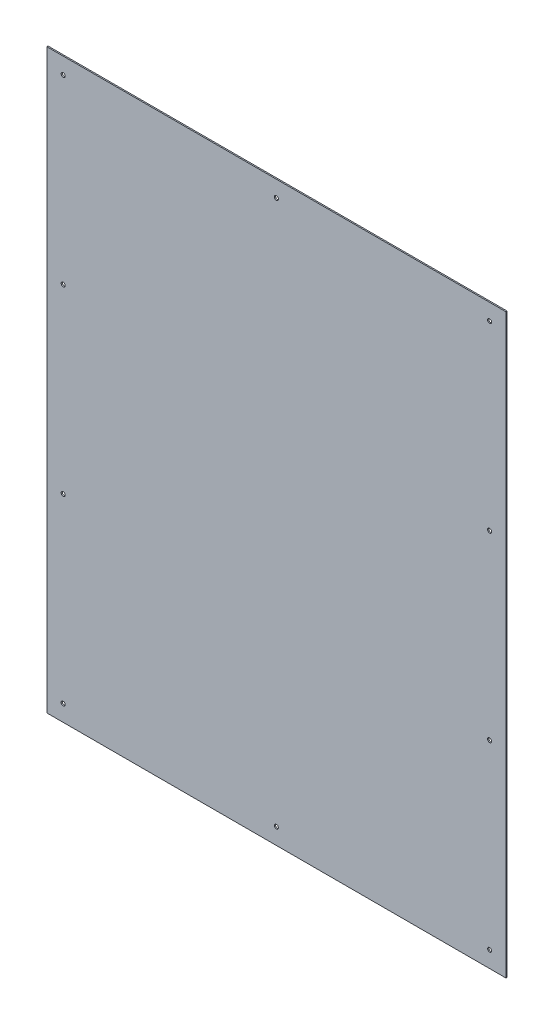
ISO-10303-21;
HEADER;
FILE_DESCRIPTION(('STEP AP214'),'2;1');
FILE_NAME('part.step','',(''),(''),'','','');
FILE_SCHEMA(('AUTOMOTIVE_DESIGN { 1 0 10303 214 1 1 1 1 }'));
ENDSEC;
DATA;
#1=APPLICATION_CONTEXT('core data for automotive mechanical design processes');
#2=APPLICATION_PROTOCOL_DEFINITION('international standard','automotive_design',2000,#1);
#3=PRODUCT_CONTEXT('',#1,'mechanical');
#4=PRODUCT('Part','Part','',(#3));
#5=PRODUCT_RELATED_PRODUCT_CATEGORY('part','',(#4));
#6=PRODUCT_DEFINITION_FORMATION('','',#4);
#7=PRODUCT_DEFINITION_CONTEXT('part definition',#1,'design');
#8=PRODUCT_DEFINITION('design','',#6,#7);
#9=PRODUCT_DEFINITION_SHAPE('','',#8);
#10=(LENGTH_UNIT() NAMED_UNIT(*) SI_UNIT(.MILLI.,.METRE.));
#11=(NAMED_UNIT(*) PLANE_ANGLE_UNIT() SI_UNIT($,.RADIAN.));
#12=(NAMED_UNIT(*) SI_UNIT($,.STERADIAN.) SOLID_ANGLE_UNIT());
#13=UNCERTAINTY_MEASURE_WITH_UNIT(LENGTH_MEASURE(1.E-05),#10,'distance_accuracy_value','');
#14=(GEOMETRIC_REPRESENTATION_CONTEXT(3) GLOBAL_UNCERTAINTY_ASSIGNED_CONTEXT((#13)) GLOBAL_UNIT_ASSIGNED_CONTEXT((#10,
#11,#12)) REPRESENTATION_CONTEXT('',''));
#15=CARTESIAN_POINT('',(0.,0.,0.));
#16=DIRECTION('',(0.,0.,1.));
#17=DIRECTION('',(1.,0.,0.));
#18=AXIS2_PLACEMENT_3D('',#15,#16,#17);
#19=CARTESIAN_POINT('',(358.,450.,1.9));
#20=DIRECTION('',(-1.,0.,0.));
#21=DIRECTION('',(0.,-1.,0.));
#22=AXIS2_PLACEMENT_3D('',#19,#20,#21);
#23=PLANE('',#22);
#24=DIRECTION('',(0.,1.,0.));
#25=VECTOR('',#24,1.);
#26=CARTESIAN_POINT('',(358.,450.,0.));
#27=LINE('',#26,#25);
#28=CARTESIAN_POINT('',(358.,-450.,0.));
#29=VERTEX_POINT('',#28);
#30=CARTESIAN_POINT('',(358.,450.,0.));
#31=VERTEX_POINT('',#30);
#32=EDGE_CURVE('E98',#29,#31,#27,.T.);
#33=ORIENTED_EDGE('',*,*,#32,.T.);
#34=DIRECTION('',(0.,0.,-1.));
#35=VECTOR('',#34,1.);
#36=CARTESIAN_POINT('',(358.,450.,1.9));
#37=LINE('',#36,#35);
#38=CARTESIAN_POINT('',(358.,450.,1.9));
#39=VERTEX_POINT('',#38);
#40=EDGE_CURVE('E11',#39,#31,#37,.T.);
#41=ORIENTED_EDGE('',*,*,#40,.F.);
#42=DIRECTION('',(0.,1.,0.));
#43=VECTOR('',#42,1.);
#44=CARTESIAN_POINT('',(358.,450.,1.9));
#45=LINE('',#44,#43);
#46=CARTESIAN_POINT('',(358.,-450.,1.9));
#47=VERTEX_POINT('',#46);
#48=EDGE_CURVE('E85',#47,#39,#45,.T.);
#49=ORIENTED_EDGE('',*,*,#48,.F.);
#50=DIRECTION('',(0.,0.,-1.));
#51=VECTOR('',#50,1.);
#52=CARTESIAN_POINT('',(358.,-450.,1.9));
#53=LINE('',#52,#51);
#54=EDGE_CURVE('E94',#47,#29,#53,.T.);
#55=ORIENTED_EDGE('',*,*,#54,.T.);
#56=EDGE_LOOP('',(#33,#41,#49,#55));
#57=FACE_BOUND('',#56,.T.);
#58=ADVANCED_FACE('F32',(#57),#23,.F.);
#59=CARTESIAN_POINT('',(-358.,450.,1.9));
#60=DIRECTION('',(0.,-1.,0.));
#61=DIRECTION('',(0.,0.,-1.));
#62=AXIS2_PLACEMENT_3D('',#59,#60,#61);
#63=PLANE('',#62);
#64=DIRECTION('',(-1.,0.,0.));
#65=VECTOR('',#64,1.);
#66=CARTESIAN_POINT('',(-358.,450.,0.));
#67=LINE('',#66,#65);
#68=CARTESIAN_POINT('',(-358.,450.,0.));
#69=VERTEX_POINT('',#68);
#70=EDGE_CURVE('E89',#31,#69,#67,.T.);
#71=ORIENTED_EDGE('',*,*,#70,.T.);
#72=DIRECTION('',(0.,0.,-1.));
#73=VECTOR('',#72,1.);
#74=CARTESIAN_POINT('',(-358.,450.,1.9));
#75=LINE('',#74,#73);
#76=CARTESIAN_POINT('',(-358.,450.,1.9));
#77=VERTEX_POINT('',#76);
#78=EDGE_CURVE('E41',#77,#69,#75,.T.);
#79=ORIENTED_EDGE('',*,*,#78,.F.);
#80=DIRECTION('',(-1.,0.,0.));
#81=VECTOR('',#80,1.);
#82=CARTESIAN_POINT('',(-358.,450.,1.9));
#83=LINE('',#82,#81);
#84=EDGE_CURVE('E80',#39,#77,#83,.T.);
#85=ORIENTED_EDGE('',*,*,#84,.F.);
#86=ORIENTED_EDGE('',*,*,#40,.T.);
#87=EDGE_LOOP('',(#71,#79,#85,#86));
#88=FACE_BOUND('',#87,.T.);
#89=ADVANCED_FACE('F88',(#88),#63,.F.);
#90=CARTESIAN_POINT('',(-358.,450.,1.9));
#91=DIRECTION('',(1.,0.,0.));
#92=DIRECTION('',(0.,1.,0.));
#93=AXIS2_PLACEMENT_3D('',#90,#91,#92);
#94=PLANE('',#93);
#95=DIRECTION('',(0.,-1.,0.));
#96=VECTOR('',#95,1.);
#97=CARTESIAN_POINT('',(-358.,450.,0.));
#98=LINE('',#97,#96);
#99=CARTESIAN_POINT('',(-358.,-450.,0.));
#100=VERTEX_POINT('',#99);
#101=EDGE_CURVE('E67',#69,#100,#98,.T.);
#102=ORIENTED_EDGE('',*,*,#101,.T.);
#103=DIRECTION('',(0.,0.,-1.));
#104=VECTOR('',#103,1.);
#105=CARTESIAN_POINT('',(-358.,-450.,1.9));
#106=LINE('',#105,#104);
#107=CARTESIAN_POINT('',(-358.,-450.,1.9));
#108=VERTEX_POINT('',#107);
#109=EDGE_CURVE('E90',#108,#100,#106,.T.);
#110=ORIENTED_EDGE('',*,*,#109,.F.);
#111=DIRECTION('',(0.,-1.,0.));
#112=VECTOR('',#111,1.);
#113=CARTESIAN_POINT('',(-358.,450.,1.9));
#114=LINE('',#113,#112);
#115=EDGE_CURVE('E83',#77,#108,#114,.T.);
#116=ORIENTED_EDGE('',*,*,#115,.F.);
#117=ORIENTED_EDGE('',*,*,#78,.T.);
#118=EDGE_LOOP('',(#102,#110,#116,#117));
#119=FACE_BOUND('',#118,.T.);
#120=ADVANCED_FACE('F92',(#119),#94,.F.);
#121=CARTESIAN_POINT('',(-358.,-450.,1.9));
#122=DIRECTION('',(0.,1.,0.));
#123=DIRECTION('',(0.,0.,1.));
#124=AXIS2_PLACEMENT_3D('',#121,#122,#123);
#125=PLANE('',#124);
#126=DIRECTION('',(1.,0.,0.));
#127=VECTOR('',#126,1.);
#128=CARTESIAN_POINT('',(-358.,-450.,0.));
#129=LINE('',#128,#127);
#130=EDGE_CURVE('E73',#100,#29,#129,.T.);
#131=ORIENTED_EDGE('',*,*,#130,.T.);
#132=ORIENTED_EDGE('',*,*,#54,.F.);
#133=DIRECTION('',(1.,0.,0.));
#134=VECTOR('',#133,1.);
#135=CARTESIAN_POINT('',(-358.,-450.,1.9));
#136=LINE('',#135,#134);
#137=EDGE_CURVE('E50',#108,#47,#136,.T.);
#138=ORIENTED_EDGE('',*,*,#137,.F.);
#139=ORIENTED_EDGE('',*,*,#109,.T.);
#140=EDGE_LOOP('',(#131,#132,#138,#139));
#141=FACE_BOUND('',#140,.T.);
#142=ADVANCED_FACE('F176',(#141),#125,.F.);
#143=CARTESIAN_POINT('',(0.,0.,1.9));
#144=DIRECTION('',(0.,0.,1.));
#145=DIRECTION('',(1.,0.,0.));
#146=AXIS2_PLACEMENT_3D('',#143,#144,#145);
#147=PLANE('',#146);
#148=CARTESIAN_POINT('',(-332.6,-424.6,1.9));
#149=DIRECTION('',(0.,0.,1.));
#150=DIRECTION('',(-1.,0.,0.));
#151=AXIS2_PLACEMENT_3D('',#148,#149,#150);
#152=CIRCLE('',#151,3.17500000000005);
#153=CARTESIAN_POINT('',(-335.775,-424.6,1.9));
#154=VERTEX_POINT('',#153);
#155=EDGE_CURVE('E147',#154,#154,#152,.T.);
#156=ORIENTED_EDGE('',*,*,#155,.F.);
#157=EDGE_LOOP('',(#156));
#158=FACE_BOUND('',#157,.T.);
#159=CARTESIAN_POINT('',(-332.599999999996,141.54,1.9));
#160=DIRECTION('',(0.,0.,1.));
#161=DIRECTION('',(1.,0.,0.));
#162=AXIS2_PLACEMENT_3D('',#159,#160,#161);
#163=CIRCLE('',#162,3.17499999999997);
#164=CARTESIAN_POINT('',(-329.424999999996,141.54,1.9));
#165=VERTEX_POINT('',#164);
#166=EDGE_CURVE('E155',#165,#165,#163,.T.);
#167=ORIENTED_EDGE('',*,*,#166,.F.);
#168=EDGE_LOOP('',(#167));
#169=FACE_BOUND('',#168,.T.);
#170=CARTESIAN_POINT('',(-332.599999999992,-141.52,1.9));
#171=DIRECTION('',(0.,0.,1.));
#172=DIRECTION('',(1.,0.,0.));
#173=AXIS2_PLACEMENT_3D('',#170,#171,#172);
#174=CIRCLE('',#173,3.17499999999997);
#175=CARTESIAN_POINT('',(-329.424999999992,-141.52,1.9));
#176=VERTEX_POINT('',#175);
#177=EDGE_CURVE('E158',#176,#176,#174,.T.);
#178=ORIENTED_EDGE('',*,*,#177,.F.);
#179=EDGE_LOOP('',(#178));
#180=FACE_BOUND('',#179,.T.);
#181=CARTESIAN_POINT('',(332.599999999992,-141.52,1.9));
#182=DIRECTION('',(0.,0.,1.));
#183=DIRECTION('',(-1.,0.,0.));
#184=AXIS2_PLACEMENT_3D('',#181,#182,#183);
#185=CIRCLE('',#184,3.17499999999997);
#186=CARTESIAN_POINT('',(329.424999999992,-141.52,1.9));
#187=VERTEX_POINT('',#186);
#188=EDGE_CURVE('E164',#187,#187,#185,.T.);
#189=ORIENTED_EDGE('',*,*,#188,.F.);
#190=EDGE_LOOP('',(#189));
#191=FACE_BOUND('',#190,.T.);
#192=CARTESIAN_POINT('',(332.599999999996,141.54,1.9));
#193=DIRECTION('',(0.,0.,1.));
#194=DIRECTION('',(-1.,0.,0.));
#195=AXIS2_PLACEMENT_3D('',#192,#193,#194);
#196=CIRCLE('',#195,3.17499999999997);
#197=CARTESIAN_POINT('',(329.424999999996,141.54,1.9));
#198=VERTEX_POINT('',#197);
#199=EDGE_CURVE('E161',#198,#198,#196,.T.);
#200=ORIENTED_EDGE('',*,*,#199,.F.);
#201=EDGE_LOOP('',(#200));
#202=FACE_BOUND('',#201,.T.);
#203=CARTESIAN_POINT('',(-1.66533453693773E-13,-424.6,1.9));
#204=DIRECTION('',(0.,0.,1.));
#205=DIRECTION('',(-1.,0.,0.));
#206=AXIS2_PLACEMENT_3D('',#203,#204,#205);
#207=CIRCLE('',#206,3.175);
#208=CARTESIAN_POINT('',(-3.17500000000017,-424.6,1.9));
#209=VERTEX_POINT('',#208);
#210=EDGE_CURVE('E143',#209,#209,#207,.T.);
#211=ORIENTED_EDGE('',*,*,#210,.F.);
#212=EDGE_LOOP('',(#211));
#213=FACE_BOUND('',#212,.T.);
#214=CARTESIAN_POINT('',(-1.66533453693773E-13,424.6,1.9));
#215=DIRECTION('',(0.,0.,1.));
#216=DIRECTION('',(1.,0.,0.));
#217=AXIS2_PLACEMENT_3D('',#214,#215,#216);
#218=CIRCLE('',#217,3.175);
#219=CARTESIAN_POINT('',(3.17499999999983,424.6,1.9));
#220=VERTEX_POINT('',#219);
#221=EDGE_CURVE('E146',#220,#220,#218,.T.);
#222=ORIENTED_EDGE('',*,*,#221,.F.);
#223=EDGE_LOOP('',(#222));
#224=FACE_BOUND('',#223,.T.);
#225=CARTESIAN_POINT('',(332.6,-424.6,1.9));
#226=DIRECTION('',(0.,0.,1.));
#227=DIRECTION('',(-1.,0.,0.));
#228=AXIS2_PLACEMENT_3D('',#225,#226,#227);
#229=CIRCLE('',#228,3.17500000000005);
#230=CARTESIAN_POINT('',(329.425,-424.6,1.9));
#231=VERTEX_POINT('',#230);
#232=EDGE_CURVE('E150',#231,#231,#229,.T.);
#233=ORIENTED_EDGE('',*,*,#232,.F.);
#234=EDGE_LOOP('',(#233));
#235=FACE_BOUND('',#234,.T.);
#236=CARTESIAN_POINT('',(332.6,424.6,1.9));
#237=DIRECTION('',(0.,0.,1.));
#238=DIRECTION('',(1.,0.,0.));
#239=AXIS2_PLACEMENT_3D('',#236,#237,#238);
#240=CIRCLE('',#239,3.17499999999997);
#241=CARTESIAN_POINT('',(335.775,424.6,1.9));
#242=VERTEX_POINT('',#241);
#243=EDGE_CURVE('E114',#242,#242,#240,.T.);
#244=ORIENTED_EDGE('',*,*,#243,.F.);
#245=EDGE_LOOP('',(#244));
#246=FACE_BOUND('',#245,.T.);
#247=CARTESIAN_POINT('',(-332.6,424.6,1.9));
#248=DIRECTION('',(0.,0.,1.));
#249=DIRECTION('',(1.,0.,0.));
#250=AXIS2_PLACEMENT_3D('',#247,#248,#249);
#251=CIRCLE('',#250,3.17499999999997);
#252=CARTESIAN_POINT('',(-329.425,424.6,1.9));
#253=VERTEX_POINT('',#252);
#254=EDGE_CURVE('E109',#253,#253,#251,.T.);
#255=ORIENTED_EDGE('',*,*,#254,.F.);
#256=EDGE_LOOP('',(#255));
#257=FACE_BOUND('',#256,.T.);
#258=ORIENTED_EDGE('',*,*,#48,.T.);
#259=ORIENTED_EDGE('',*,*,#84,.T.);
#260=ORIENTED_EDGE('',*,*,#115,.T.);
#261=ORIENTED_EDGE('',*,*,#137,.T.);
#262=EDGE_LOOP('',(#258,#259,#260,#261));
#263=FACE_BOUND('',#262,.T.);
#264=ADVANCED_FACE('F81',(#158,#169,#180,#191,#202,#213,#224,#235,#246,#257,#263),#147,.T.);
#265=CARTESIAN_POINT('',(0.,0.,0.));
#266=DIRECTION('',(0.,0.,1.));
#267=DIRECTION('',(1.,0.,0.));
#268=AXIS2_PLACEMENT_3D('',#265,#266,#267);
#269=PLANE('',#268);
#270=CARTESIAN_POINT('',(-332.6,-424.6,0.));
#271=DIRECTION('',(0.,0.,1.));
#272=DIRECTION('',(1.,0.,0.));
#273=AXIS2_PLACEMENT_3D('',#270,#271,#272);
#274=CIRCLE('',#273,3.17500000000005);
#275=CARTESIAN_POINT('',(-329.425,-424.6,0.));
#276=VERTEX_POINT('',#275);
#277=EDGE_CURVE('E35',#276,#276,#274,.T.);
#278=ORIENTED_EDGE('',*,*,#277,.T.);
#279=EDGE_LOOP('',(#278));
#280=FACE_BOUND('',#279,.T.);
#281=CARTESIAN_POINT('',(-332.599999999996,141.54,0.));
#282=DIRECTION('',(0.,0.,1.));
#283=DIRECTION('',(1.,0.,0.));
#284=AXIS2_PLACEMENT_3D('',#281,#282,#283);
#285=CIRCLE('',#284,3.17499999999997);
#286=CARTESIAN_POINT('',(-329.424999999996,141.54,0.));
#287=VERTEX_POINT('',#286);
#288=EDGE_CURVE('E131',#287,#287,#285,.T.);
#289=ORIENTED_EDGE('',*,*,#288,.T.);
#290=EDGE_LOOP('',(#289));
#291=FACE_BOUND('',#290,.T.);
#292=CARTESIAN_POINT('',(-332.599999999992,-141.52,0.));
#293=DIRECTION('',(0.,0.,1.));
#294=DIRECTION('',(1.,0.,0.));
#295=AXIS2_PLACEMENT_3D('',#292,#293,#294);
#296=CIRCLE('',#295,3.17499999999997);
#297=CARTESIAN_POINT('',(-329.424999999992,-141.52,0.));
#298=VERTEX_POINT('',#297);
#299=EDGE_CURVE('E129',#298,#298,#296,.T.);
#300=ORIENTED_EDGE('',*,*,#299,.T.);
#301=EDGE_LOOP('',(#300));
#302=FACE_BOUND('',#301,.T.);
#303=CARTESIAN_POINT('',(332.599999999992,-141.52,0.));
#304=DIRECTION('',(0.,0.,1.));
#305=DIRECTION('',(1.,0.,0.));
#306=AXIS2_PLACEMENT_3D('',#303,#304,#305);
#307=CIRCLE('',#306,3.17499999999997);
#308=CARTESIAN_POINT('',(335.774999999992,-141.52,0.));
#309=VERTEX_POINT('',#308);
#310=EDGE_CURVE('E126',#309,#309,#307,.T.);
#311=ORIENTED_EDGE('',*,*,#310,.T.);
#312=EDGE_LOOP('',(#311));
#313=FACE_BOUND('',#312,.T.);
#314=CARTESIAN_POINT('',(332.599999999996,141.54,0.));
#315=DIRECTION('',(0.,0.,1.));
#316=DIRECTION('',(1.,0.,0.));
#317=AXIS2_PLACEMENT_3D('',#314,#315,#316);
#318=CIRCLE('',#317,3.17499999999997);
#319=CARTESIAN_POINT('',(335.774999999996,141.54,0.));
#320=VERTEX_POINT('',#319);
#321=EDGE_CURVE('E123',#320,#320,#318,.T.);
#322=ORIENTED_EDGE('',*,*,#321,.T.);
#323=EDGE_LOOP('',(#322));
#324=FACE_BOUND('',#323,.T.);
#325=CARTESIAN_POINT('',(-1.66533453693773E-13,-424.6,0.));
#326=DIRECTION('',(0.,0.,1.));
#327=DIRECTION('',(1.,0.,0.));
#328=AXIS2_PLACEMENT_3D('',#325,#326,#327);
#329=CIRCLE('',#328,3.175);
#330=CARTESIAN_POINT('',(3.17499999999983,-424.6,0.));
#331=VERTEX_POINT('',#330);
#332=EDGE_CURVE('E120',#331,#331,#329,.T.);
#333=ORIENTED_EDGE('',*,*,#332,.T.);
#334=EDGE_LOOP('',(#333));
#335=FACE_BOUND('',#334,.T.);
#336=CARTESIAN_POINT('',(-1.66533453693773E-13,424.6,0.));
#337=DIRECTION('',(0.,0.,1.));
#338=DIRECTION('',(1.,0.,0.));
#339=AXIS2_PLACEMENT_3D('',#336,#337,#338);
#340=CIRCLE('',#339,3.175);
#341=CARTESIAN_POINT('',(3.17499999999983,424.6,0.));
#342=VERTEX_POINT('',#341);
#343=EDGE_CURVE('E117',#342,#342,#340,.T.);
#344=ORIENTED_EDGE('',*,*,#343,.T.);
#345=EDGE_LOOP('',(#344));
#346=FACE_BOUND('',#345,.T.);
#347=CARTESIAN_POINT('',(332.6,-424.6,0.));
#348=DIRECTION('',(0.,0.,1.));
#349=DIRECTION('',(1.,0.,0.));
#350=AXIS2_PLACEMENT_3D('',#347,#348,#349);
#351=CIRCLE('',#350,3.17500000000005);
#352=CARTESIAN_POINT('',(335.775,-424.6,0.));
#353=VERTEX_POINT('',#352);
#354=EDGE_CURVE('E113',#353,#353,#351,.T.);
#355=ORIENTED_EDGE('',*,*,#354,.T.);
#356=EDGE_LOOP('',(#355));
#357=FACE_BOUND('',#356,.T.);
#358=CARTESIAN_POINT('',(332.6,424.6,0.));
#359=DIRECTION('',(0.,0.,1.));
#360=DIRECTION('',(1.,0.,0.));
#361=AXIS2_PLACEMENT_3D('',#358,#359,#360);
#362=CIRCLE('',#361,3.17499999999997);
#363=CARTESIAN_POINT('',(335.775,424.6,0.));
#364=VERTEX_POINT('',#363);
#365=EDGE_CURVE('E110',#364,#364,#362,.T.);
#366=ORIENTED_EDGE('',*,*,#365,.T.);
#367=EDGE_LOOP('',(#366));
#368=FACE_BOUND('',#367,.T.);
#369=CARTESIAN_POINT('',(-332.6,424.6,0.));
#370=DIRECTION('',(0.,0.,1.));
#371=DIRECTION('',(1.,0.,0.));
#372=AXIS2_PLACEMENT_3D('',#369,#370,#371);
#373=CIRCLE('',#372,3.17499999999997);
#374=CARTESIAN_POINT('',(-329.425,424.6,0.));
#375=VERTEX_POINT('',#374);
#376=EDGE_CURVE('E101',#375,#375,#373,.T.);
#377=ORIENTED_EDGE('',*,*,#376,.T.);
#378=EDGE_LOOP('',(#377));
#379=FACE_BOUND('',#378,.T.);
#380=ORIENTED_EDGE('',*,*,#32,.F.);
#381=ORIENTED_EDGE('',*,*,#130,.F.);
#382=ORIENTED_EDGE('',*,*,#101,.F.);
#383=ORIENTED_EDGE('',*,*,#70,.F.);
#384=EDGE_LOOP('',(#380,#381,#382,#383));
#385=FACE_BOUND('',#384,.T.);
#386=ADVANCED_FACE('F175',(#280,#291,#302,#313,#324,#335,#346,#357,#368,#379,#385),#269,.F.);
#387=CARTESIAN_POINT('',(-332.6,424.6,-8.1));
#388=DIRECTION('',(0.,0.,1.));
#389=DIRECTION('',(1.,0.,0.));
#390=AXIS2_PLACEMENT_3D('',#387,#388,#389);
#391=CYLINDRICAL_SURFACE('',#390,3.17499999999997);
#392=ORIENTED_EDGE('',*,*,#254,.T.);
#393=EDGE_LOOP('',(#392));
#394=FACE_BOUND('',#393,.T.);
#395=ORIENTED_EDGE('',*,*,#376,.F.);
#396=EDGE_LOOP('',(#395));
#397=FACE_BOUND('',#396,.T.);
#398=ADVANCED_FACE('F196',(#394,#397),#391,.F.);
#399=CARTESIAN_POINT('',(332.6,424.6,-8.1));
#400=DIRECTION('',(0.,0.,1.));
#401=DIRECTION('',(1.,0.,0.));
#402=AXIS2_PLACEMENT_3D('',#399,#400,#401);
#403=CYLINDRICAL_SURFACE('',#402,3.17499999999997);
#404=ORIENTED_EDGE('',*,*,#243,.T.);
#405=EDGE_LOOP('',(#404));
#406=FACE_BOUND('',#405,.T.);
#407=ORIENTED_EDGE('',*,*,#365,.F.);
#408=EDGE_LOOP('',(#407));
#409=FACE_BOUND('',#408,.T.);
#410=ADVANCED_FACE('F192',(#406,#409),#403,.F.);
#411=CARTESIAN_POINT('',(332.6,-424.6,-8.1));
#412=DIRECTION('',(0.,0.,1.));
#413=DIRECTION('',(1.,0.,0.));
#414=AXIS2_PLACEMENT_3D('',#411,#412,#413);
#415=CYLINDRICAL_SURFACE('',#414,3.17500000000005);
#416=ORIENTED_EDGE('',*,*,#232,.T.);
#417=EDGE_LOOP('',(#416));
#418=FACE_BOUND('',#417,.T.);
#419=ORIENTED_EDGE('',*,*,#354,.F.);
#420=EDGE_LOOP('',(#419));
#421=FACE_BOUND('',#420,.T.);
#422=ADVANCED_FACE('F195',(#418,#421),#415,.F.);
#423=CARTESIAN_POINT('',(-1.66533453693773E-13,424.6,-8.1));
#424=DIRECTION('',(0.,0.,1.));
#425=DIRECTION('',(1.,0.,0.));
#426=AXIS2_PLACEMENT_3D('',#423,#424,#425);
#427=CYLINDRICAL_SURFACE('',#426,3.175);
#428=ORIENTED_EDGE('',*,*,#221,.T.);
#429=EDGE_LOOP('',(#428));
#430=FACE_BOUND('',#429,.T.);
#431=ORIENTED_EDGE('',*,*,#343,.F.);
#432=EDGE_LOOP('',(#431));
#433=FACE_BOUND('',#432,.T.);
#434=ADVANCED_FACE('F262',(#430,#433),#427,.F.);
#435=CARTESIAN_POINT('',(-1.66533453693773E-13,-424.6,-8.1));
#436=DIRECTION('',(0.,0.,1.));
#437=DIRECTION('',(1.,0.,0.));
#438=AXIS2_PLACEMENT_3D('',#435,#436,#437);
#439=CYLINDRICAL_SURFACE('',#438,3.175);
#440=ORIENTED_EDGE('',*,*,#210,.T.);
#441=EDGE_LOOP('',(#440));
#442=FACE_BOUND('',#441,.T.);
#443=ORIENTED_EDGE('',*,*,#332,.F.);
#444=EDGE_LOOP('',(#443));
#445=FACE_BOUND('',#444,.T.);
#446=ADVANCED_FACE('F272',(#442,#445),#439,.F.);
#447=CARTESIAN_POINT('',(332.599999999996,141.54,-8.1));
#448=DIRECTION('',(0.,0.,1.));
#449=DIRECTION('',(1.,0.,0.));
#450=AXIS2_PLACEMENT_3D('',#447,#448,#449);
#451=CYLINDRICAL_SURFACE('',#450,3.17499999999997);
#452=ORIENTED_EDGE('',*,*,#199,.T.);
#453=EDGE_LOOP('',(#452));
#454=FACE_BOUND('',#453,.T.);
#455=ORIENTED_EDGE('',*,*,#321,.F.);
#456=EDGE_LOOP('',(#455));
#457=FACE_BOUND('',#456,.T.);
#458=ADVANCED_FACE('F282',(#454,#457),#451,.F.);
#459=CARTESIAN_POINT('',(332.599999999992,-141.52,-8.1));
#460=DIRECTION('',(0.,0.,1.));
#461=DIRECTION('',(1.,0.,0.));
#462=AXIS2_PLACEMENT_3D('',#459,#460,#461);
#463=CYLINDRICAL_SURFACE('',#462,3.17499999999997);
#464=ORIENTED_EDGE('',*,*,#188,.T.);
#465=EDGE_LOOP('',(#464));
#466=FACE_BOUND('',#465,.T.);
#467=ORIENTED_EDGE('',*,*,#310,.F.);
#468=EDGE_LOOP('',(#467));
#469=FACE_BOUND('',#468,.T.);
#470=ADVANCED_FACE('F292',(#466,#469),#463,.F.);
#471=CARTESIAN_POINT('',(-332.599999999992,-141.52,-8.1));
#472=DIRECTION('',(0.,0.,1.));
#473=DIRECTION('',(1.,0.,0.));
#474=AXIS2_PLACEMENT_3D('',#471,#472,#473);
#475=CYLINDRICAL_SURFACE('',#474,3.17499999999997);
#476=ORIENTED_EDGE('',*,*,#177,.T.);
#477=EDGE_LOOP('',(#476));
#478=FACE_BOUND('',#477,.T.);
#479=ORIENTED_EDGE('',*,*,#299,.F.);
#480=EDGE_LOOP('',(#479));
#481=FACE_BOUND('',#480,.T.);
#482=ADVANCED_FACE('F170',(#478,#481),#475,.F.);
#483=CARTESIAN_POINT('',(-332.599999999996,141.54,-8.1));
#484=DIRECTION('',(0.,0.,1.));
#485=DIRECTION('',(1.,0.,0.));
#486=AXIS2_PLACEMENT_3D('',#483,#484,#485);
#487=CYLINDRICAL_SURFACE('',#486,3.17499999999997);
#488=ORIENTED_EDGE('',*,*,#166,.T.);
#489=EDGE_LOOP('',(#488));
#490=FACE_BOUND('',#489,.T.);
#491=ORIENTED_EDGE('',*,*,#288,.F.);
#492=EDGE_LOOP('',(#491));
#493=FACE_BOUND('',#492,.T.);
#494=ADVANCED_FACE('F311',(#490,#493),#487,.F.);
#495=CARTESIAN_POINT('',(-332.6,-424.6,-8.1));
#496=DIRECTION('',(0.,0.,1.));
#497=DIRECTION('',(1.,0.,0.));
#498=AXIS2_PLACEMENT_3D('',#495,#496,#497);
#499=CYLINDRICAL_SURFACE('',#498,3.17500000000005);
#500=ORIENTED_EDGE('',*,*,#155,.T.);
#501=EDGE_LOOP('',(#500));
#502=FACE_BOUND('',#501,.T.);
#503=ORIENTED_EDGE('',*,*,#277,.F.);
#504=EDGE_LOOP('',(#503));
#505=FACE_BOUND('',#504,.T.);
#506=ADVANCED_FACE('F320',(#502,#505),#499,.F.);
#507=CLOSED_SHELL('',(#58,#89,#120,#142,#264,#386,#398,#410,#422,#434,#446,#458,#470,#482,#494,#506));
#508=MANIFOLD_SOLID_BREP('B2',#507);
#509=ADVANCED_BREP_SHAPE_REPRESENTATION('',(#18,#508),#14);
#510=SHAPE_DEFINITION_REPRESENTATION(#9,#509);
ENDSEC;
END-ISO-10303-21;
